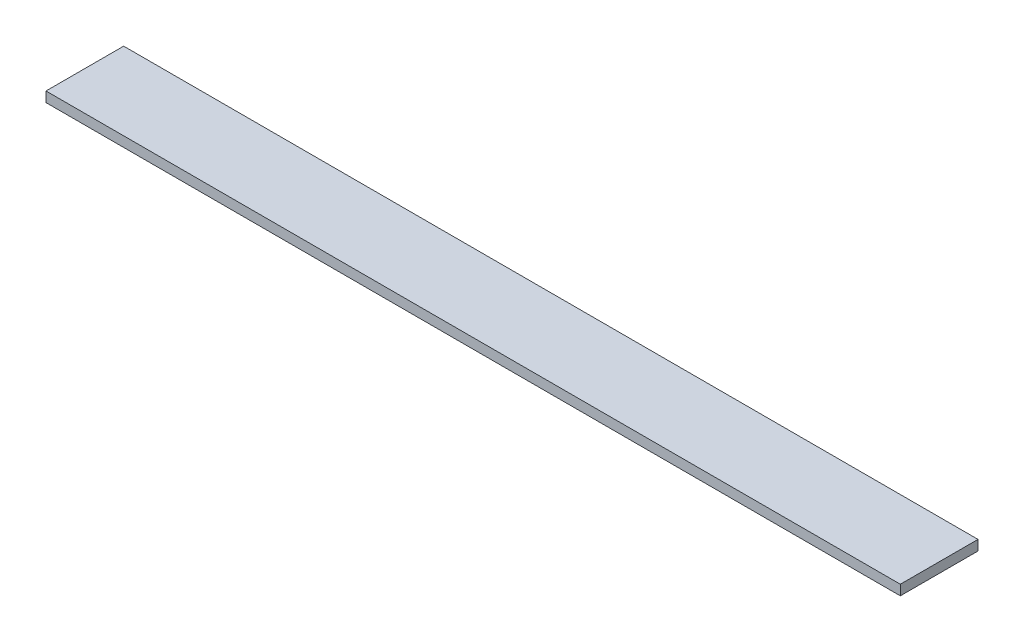
ISO-10303-21;
HEADER;
FILE_DESCRIPTION(('STEP AP214'),'2;1');
FILE_NAME('part.step','',(''),(''),'','','');
FILE_SCHEMA(('AUTOMOTIVE_DESIGN { 1 0 10303 214 1 1 1 1 }'));
ENDSEC;
DATA;
#1=APPLICATION_CONTEXT('core data for automotive mechanical design processes');
#2=APPLICATION_PROTOCOL_DEFINITION('international standard','automotive_design',2000,#1);
#3=PRODUCT_CONTEXT('',#1,'mechanical');
#4=PRODUCT('Part','Part','',(#3));
#5=PRODUCT_RELATED_PRODUCT_CATEGORY('part','',(#4));
#6=PRODUCT_DEFINITION_FORMATION('','',#4);
#7=PRODUCT_DEFINITION_CONTEXT('part definition',#1,'design');
#8=PRODUCT_DEFINITION('design','',#6,#7);
#9=PRODUCT_DEFINITION_SHAPE('','',#8);
#10=(LENGTH_UNIT() NAMED_UNIT(*) SI_UNIT(.MILLI.,.METRE.));
#11=(NAMED_UNIT(*) PLANE_ANGLE_UNIT() SI_UNIT($,.RADIAN.));
#12=(NAMED_UNIT(*) SI_UNIT($,.STERADIAN.) SOLID_ANGLE_UNIT());
#13=UNCERTAINTY_MEASURE_WITH_UNIT(LENGTH_MEASURE(1.E-05),#10,'distance_accuracy_value','');
#14=(GEOMETRIC_REPRESENTATION_CONTEXT(3) GLOBAL_UNCERTAINTY_ASSIGNED_CONTEXT((#13)) GLOBAL_UNIT_ASSIGNED_CONTEXT((#10,
#11,#12)) REPRESENTATION_CONTEXT('',''));
#15=CARTESIAN_POINT('',(0.,0.,0.));
#16=DIRECTION('',(0.,0.,1.));
#17=DIRECTION('',(1.,0.,0.));
#18=AXIS2_PLACEMENT_3D('',#15,#16,#17);
#19=CARTESIAN_POINT('',(0.,2.,0.));
#20=DIRECTION('',(0.,-1.,0.));
#21=DIRECTION('',(0.,0.,-1.));
#22=AXIS2_PLACEMENT_3D('',#19,#20,#21);
#23=PLANE('',#22);
#24=DIRECTION('',(-1.,0.,0.));
#25=VECTOR('',#24,1.);
#26=CARTESIAN_POINT('',(0.,2.,10.));
#27=LINE('',#26,#25);
#28=CARTESIAN_POINT('',(0.,2.,10.));
#29=VERTEX_POINT('',#28);
#30=CARTESIAN_POINT('',(-110.,2.,10.));
#31=VERTEX_POINT('',#30);
#32=EDGE_CURVE('E65',#29,#31,#27,.T.);
#33=ORIENTED_EDGE('',*,*,#32,.T.);
#34=DIRECTION('',(0.,0.,-1.));
#35=VECTOR('',#34,1.);
#36=CARTESIAN_POINT('',(-110.,2.,10.));
#37=LINE('',#36,#35);
#38=CARTESIAN_POINT('',(-110.,2.,0.));
#39=VERTEX_POINT('',#38);
#40=EDGE_CURVE('E20',#31,#39,#37,.T.);
#41=ORIENTED_EDGE('',*,*,#40,.T.);
#42=DIRECTION('',(1.,0.,0.));
#43=VECTOR('',#42,1.);
#44=CARTESIAN_POINT('',(-110.,2.,0.));
#45=LINE('',#44,#43);
#46=CARTESIAN_POINT('',(0.,2.,0.));
#47=VERTEX_POINT('',#46);
#48=EDGE_CURVE('E67',#39,#47,#45,.T.);
#49=ORIENTED_EDGE('',*,*,#48,.T.);
#50=DIRECTION('',(0.,0.,1.));
#51=VECTOR('',#50,1.);
#52=CARTESIAN_POINT('',(0.,2.,0.));
#53=LINE('',#52,#51);
#54=EDGE_CURVE('E62',#47,#29,#53,.T.);
#55=ORIENTED_EDGE('',*,*,#54,.T.);
#56=EDGE_LOOP('',(#33,#41,#49,#55));
#57=FACE_BOUND('',#56,.T.);
#58=ADVANCED_FACE('F16',(#57),#23,.T.);
#59=CARTESIAN_POINT('',(0.,3.3,0.));
#60=DIRECTION('',(0.,-1.,0.));
#61=DIRECTION('',(0.,0.,-1.));
#62=AXIS2_PLACEMENT_3D('',#59,#60,#61);
#63=PLANE('',#62);
#64=DIRECTION('',(-1.,0.,0.));
#65=VECTOR('',#64,1.);
#66=CARTESIAN_POINT('',(0.,3.3,10.));
#67=LINE('',#66,#65);
#68=CARTESIAN_POINT('',(0.,3.3,10.));
#69=VERTEX_POINT('',#68);
#70=CARTESIAN_POINT('',(-110.,3.3,10.));
#71=VERTEX_POINT('',#70);
#72=EDGE_CURVE('E85',#69,#71,#67,.T.);
#73=ORIENTED_EDGE('',*,*,#72,.F.);
#74=DIRECTION('',(0.,0.,1.));
#75=VECTOR('',#74,1.);
#76=CARTESIAN_POINT('',(0.,3.3,0.));
#77=LINE('',#76,#75);
#78=CARTESIAN_POINT('',(0.,3.3,0.));
#79=VERTEX_POINT('',#78);
#80=EDGE_CURVE('E80',#79,#69,#77,.T.);
#81=ORIENTED_EDGE('',*,*,#80,.F.);
#82=DIRECTION('',(1.,0.,0.));
#83=VECTOR('',#82,1.);
#84=CARTESIAN_POINT('',(-110.,3.3,0.));
#85=LINE('',#84,#83);
#86=CARTESIAN_POINT('',(-110.,3.3,0.));
#87=VERTEX_POINT('',#86);
#88=EDGE_CURVE('E97',#87,#79,#85,.T.);
#89=ORIENTED_EDGE('',*,*,#88,.F.);
#90=DIRECTION('',(0.,0.,-1.));
#91=VECTOR('',#90,1.);
#92=CARTESIAN_POINT('',(-110.,3.3,10.));
#93=LINE('',#92,#91);
#94=EDGE_CURVE('E10',#71,#87,#93,.T.);
#95=ORIENTED_EDGE('',*,*,#94,.F.);
#96=EDGE_LOOP('',(#73,#81,#89,#95));
#97=FACE_BOUND('',#96,.T.);
#98=ADVANCED_FACE('F128',(#97),#63,.F.);
#99=CARTESIAN_POINT('',(-110.,3.3,10.));
#100=DIRECTION('',(-1.,0.,0.));
#101=DIRECTION('',(0.,0.,1.));
#102=AXIS2_PLACEMENT_3D('',#99,#100,#101);
#103=PLANE('',#102);
#104=ORIENTED_EDGE('',*,*,#40,.F.);
#105=DIRECTION('',(0.,-1.,0.));
#106=VECTOR('',#105,1.);
#107=CARTESIAN_POINT('',(-110.,3.3,10.));
#108=LINE('',#107,#106);
#109=EDGE_CURVE('E73',#71,#31,#108,.T.);
#110=ORIENTED_EDGE('',*,*,#109,.F.);
#111=ORIENTED_EDGE('',*,*,#94,.T.);
#112=DIRECTION('',(0.,-1.,0.));
#113=VECTOR('',#112,1.);
#114=CARTESIAN_POINT('',(-110.,3.3,0.));
#115=LINE('',#114,#113);
#116=EDGE_CURVE('E95',#87,#39,#115,.T.);
#117=ORIENTED_EDGE('',*,*,#116,.T.);
#118=EDGE_LOOP('',(#104,#110,#111,#117));
#119=FACE_BOUND('',#118,.T.);
#120=ADVANCED_FACE('F129',(#119),#103,.T.);
#121=CARTESIAN_POINT('',(-110.,3.3,0.));
#122=DIRECTION('',(0.,0.,-1.));
#123=DIRECTION('',(0.,-1.,0.));
#124=AXIS2_PLACEMENT_3D('',#121,#122,#123);
#125=PLANE('',#124);
#126=ORIENTED_EDGE('',*,*,#48,.F.);
#127=ORIENTED_EDGE('',*,*,#116,.F.);
#128=ORIENTED_EDGE('',*,*,#88,.T.);
#129=DIRECTION('',(0.,-1.,0.));
#130=VECTOR('',#129,1.);
#131=CARTESIAN_POINT('',(0.,3.3,0.));
#132=LINE('',#131,#130);
#133=EDGE_CURVE('E72',#79,#47,#132,.T.);
#134=ORIENTED_EDGE('',*,*,#133,.T.);
#135=EDGE_LOOP('',(#126,#127,#128,#134));
#136=FACE_BOUND('',#135,.T.);
#137=ADVANCED_FACE('F116',(#136),#125,.T.);
#138=CARTESIAN_POINT('',(0.,3.3,0.));
#139=DIRECTION('',(1.,0.,0.));
#140=DIRECTION('',(0.,1.,0.));
#141=AXIS2_PLACEMENT_3D('',#138,#139,#140);
#142=PLANE('',#141);
#143=ORIENTED_EDGE('',*,*,#54,.F.);
#144=ORIENTED_EDGE('',*,*,#133,.F.);
#145=ORIENTED_EDGE('',*,*,#80,.T.);
#146=DIRECTION('',(0.,-1.,0.));
#147=VECTOR('',#146,1.);
#148=CARTESIAN_POINT('',(0.,3.3,10.));
#149=LINE('',#148,#147);
#150=EDGE_CURVE('E77',#69,#29,#149,.T.);
#151=ORIENTED_EDGE('',*,*,#150,.T.);
#152=EDGE_LOOP('',(#143,#144,#145,#151));
#153=FACE_BOUND('',#152,.T.);
#154=ADVANCED_FACE('F78',(#153),#142,.T.);
#155=CARTESIAN_POINT('',(0.,3.3,10.));
#156=DIRECTION('',(0.,0.,1.));
#157=DIRECTION('',(1.,0.,0.));
#158=AXIS2_PLACEMENT_3D('',#155,#156,#157);
#159=PLANE('',#158);
#160=ORIENTED_EDGE('',*,*,#32,.F.);
#161=ORIENTED_EDGE('',*,*,#150,.F.);
#162=ORIENTED_EDGE('',*,*,#72,.T.);
#163=ORIENTED_EDGE('',*,*,#109,.T.);
#164=EDGE_LOOP('',(#160,#161,#162,#163));
#165=FACE_BOUND('',#164,.T.);
#166=ADVANCED_FACE('F18',(#165),#159,.T.);
#167=CLOSED_SHELL('',(#58,#98,#120,#137,#154,#166));
#168=MANIFOLD_SOLID_BREP('B1',#167);
#169=ADVANCED_BREP_SHAPE_REPRESENTATION('',(#18,#168),#14);
#170=SHAPE_DEFINITION_REPRESENTATION(#9,#169);
ENDSEC;
END-ISO-10303-21;
